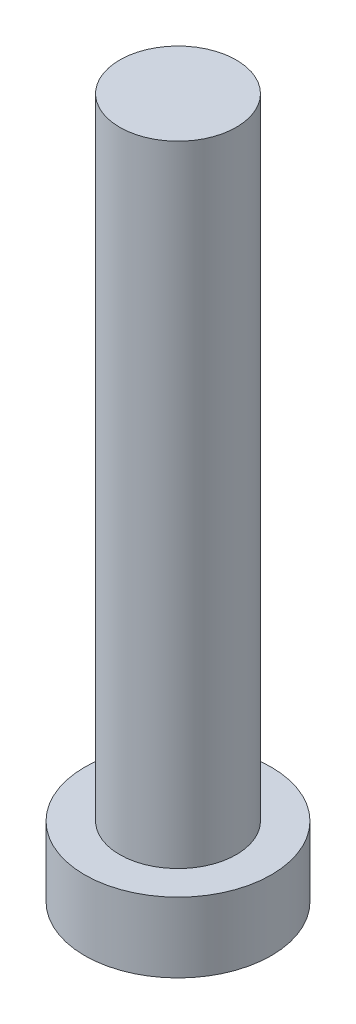
ISO-10303-21;
HEADER;
FILE_DESCRIPTION(('STEP AP214'),'2;1');
FILE_NAME('part.step','',(''),(''),'','','');
FILE_SCHEMA(('AUTOMOTIVE_DESIGN { 1 0 10303 214 1 1 1 1 }'));
ENDSEC;
DATA;
#1=APPLICATION_CONTEXT('core data for automotive mechanical design processes');
#2=APPLICATION_PROTOCOL_DEFINITION('international standard','automotive_design',2000,#1);
#3=PRODUCT_CONTEXT('',#1,'mechanical');
#4=PRODUCT('Part','Part','',(#3));
#5=PRODUCT_RELATED_PRODUCT_CATEGORY('part','',(#4));
#6=PRODUCT_DEFINITION_FORMATION('','',#4);
#7=PRODUCT_DEFINITION_CONTEXT('part definition',#1,'design');
#8=PRODUCT_DEFINITION('design','',#6,#7);
#9=PRODUCT_DEFINITION_SHAPE('','',#8);
#10=(LENGTH_UNIT() NAMED_UNIT(*) SI_UNIT(.MILLI.,.METRE.));
#11=(NAMED_UNIT(*) PLANE_ANGLE_UNIT() SI_UNIT($,.RADIAN.));
#12=(NAMED_UNIT(*) SI_UNIT($,.STERADIAN.) SOLID_ANGLE_UNIT());
#13=UNCERTAINTY_MEASURE_WITH_UNIT(LENGTH_MEASURE(1.E-05),#10,'distance_accuracy_value','');
#14=(GEOMETRIC_REPRESENTATION_CONTEXT(3) GLOBAL_UNCERTAINTY_ASSIGNED_CONTEXT((#13)) GLOBAL_UNIT_ASSIGNED_CONTEXT((#10,
#11,#12)) REPRESENTATION_CONTEXT('',''));
#15=CARTESIAN_POINT('',(0.,0.,0.));
#16=DIRECTION('',(0.,0.,1.));
#17=DIRECTION('',(1.,0.,0.));
#18=AXIS2_PLACEMENT_3D('',#15,#16,#17);
#19=CARTESIAN_POINT('',(0.,3.0001,0.));
#20=DIRECTION('',(0.,-1.,0.));
#21=DIRECTION('',(0.,0.,-1.));
#22=AXIS2_PLACEMENT_3D('',#19,#20,#21);
#23=CYLINDRICAL_SURFACE('',#22,2.5);
#24=CARTESIAN_POINT('',(0.,3.0001,0.));
#25=DIRECTION('',(0.,1.,0.));
#26=DIRECTION('',(0.,0.,1.));
#27=AXIS2_PLACEMENT_3D('',#24,#25,#26);
#28=CIRCLE('',#27,2.5);
#29=CARTESIAN_POINT('',(0.,3.0001,2.5));
#30=VERTEX_POINT('',#29);
#31=EDGE_CURVE('E12',#30,#30,#28,.T.);
#32=ORIENTED_EDGE('',*,*,#31,.F.);
#33=EDGE_LOOP('',(#32));
#34=FACE_BOUND('',#33,.T.);
#35=CARTESIAN_POINT('',(0.,-24.,0.));
#36=DIRECTION('',(0.,1.,0.));
#37=DIRECTION('',(0.,0.,1.));
#38=AXIS2_PLACEMENT_3D('',#35,#36,#37);
#39=CIRCLE('',#38,2.5);
#40=CARTESIAN_POINT('',(0.,-24.,2.5));
#41=VERTEX_POINT('',#40);
#42=EDGE_CURVE('E49',#41,#41,#39,.T.);
#43=ORIENTED_EDGE('',*,*,#42,.T.);
#44=EDGE_LOOP('',(#43));
#45=FACE_BOUND('',#44,.T.);
#46=ADVANCED_FACE('F43',(#34,#45),#23,.T.);
#47=CARTESIAN_POINT('',(0.,3.0001,0.));
#48=DIRECTION('',(0.,1.,0.));
#49=DIRECTION('',(0.,0.,1.));
#50=AXIS2_PLACEMENT_3D('',#47,#48,#49);
#51=PLANE('',#50);
#52=ORIENTED_EDGE('',*,*,#31,.T.);
#53=EDGE_LOOP('',(#52));
#54=FACE_BOUND('',#53,.T.);
#55=ADVANCED_FACE('F77',(#54),#51,.T.);
#56=CARTESIAN_POINT('',(0.,-27.,0.));
#57=DIRECTION('',(0.,1.,0.));
#58=DIRECTION('',(0.,0.,1.));
#59=AXIS2_PLACEMENT_3D('',#56,#57,#58);
#60=CYLINDRICAL_SURFACE('',#59,4.);
#61=CARTESIAN_POINT('',(0.,-27.,0.));
#62=DIRECTION('',(0.,-1.,0.));
#63=DIRECTION('',(0.,0.,-1.));
#64=AXIS2_PLACEMENT_3D('',#61,#62,#63);
#65=CIRCLE('',#64,4.);
#66=CARTESIAN_POINT('',(0.,-27.,-4.));
#67=VERTEX_POINT('',#66);
#68=EDGE_CURVE('E53',#67,#67,#65,.T.);
#69=ORIENTED_EDGE('',*,*,#68,.F.);
#70=EDGE_LOOP('',(#69));
#71=FACE_BOUND('',#70,.T.);
#72=CARTESIAN_POINT('',(0.,-24.,0.));
#73=DIRECTION('',(0.,-1.,0.));
#74=DIRECTION('',(0.,0.,-1.));
#75=AXIS2_PLACEMENT_3D('',#72,#73,#74);
#76=CIRCLE('',#75,4.);
#77=CARTESIAN_POINT('',(0.,-24.,-4.));
#78=VERTEX_POINT('',#77);
#79=EDGE_CURVE('E57',#78,#78,#76,.T.);
#80=ORIENTED_EDGE('',*,*,#79,.T.);
#81=EDGE_LOOP('',(#80));
#82=FACE_BOUND('',#81,.T.);
#83=ADVANCED_FACE('F63',(#71,#82),#60,.T.);
#84=CARTESIAN_POINT('',(0.,-27.,0.));
#85=DIRECTION('',(0.,-1.,0.));
#86=DIRECTION('',(0.,0.,-1.));
#87=AXIS2_PLACEMENT_3D('',#84,#85,#86);
#88=PLANE('',#87);
#89=ORIENTED_EDGE('',*,*,#68,.T.);
#90=EDGE_LOOP('',(#89));
#91=FACE_BOUND('',#90,.T.);
#92=ADVANCED_FACE('F67',(#91),#88,.T.);
#93=CARTESIAN_POINT('',(0.,-24.,0.));
#94=DIRECTION('',(0.,-1.,0.));
#95=DIRECTION('',(0.,0.,-1.));
#96=AXIS2_PLACEMENT_3D('',#93,#94,#95);
#97=PLANE('',#96);
#98=ORIENTED_EDGE('',*,*,#42,.F.);
#99=EDGE_LOOP('',(#98));
#100=FACE_BOUND('',#99,.T.);
#101=ORIENTED_EDGE('',*,*,#79,.F.);
#102=EDGE_LOOP('',(#101));
#103=FACE_BOUND('',#102,.T.);
#104=ADVANCED_FACE('F65',(#100,#103),#97,.F.);
#105=CLOSED_SHELL('',(#46,#55,#83,#92,#104));
#106=MANIFOLD_SOLID_BREP('B2',#105);
#107=ADVANCED_BREP_SHAPE_REPRESENTATION('',(#18,#106),#14);
#108=SHAPE_DEFINITION_REPRESENTATION(#9,#107);
ENDSEC;
END-ISO-10303-21;
